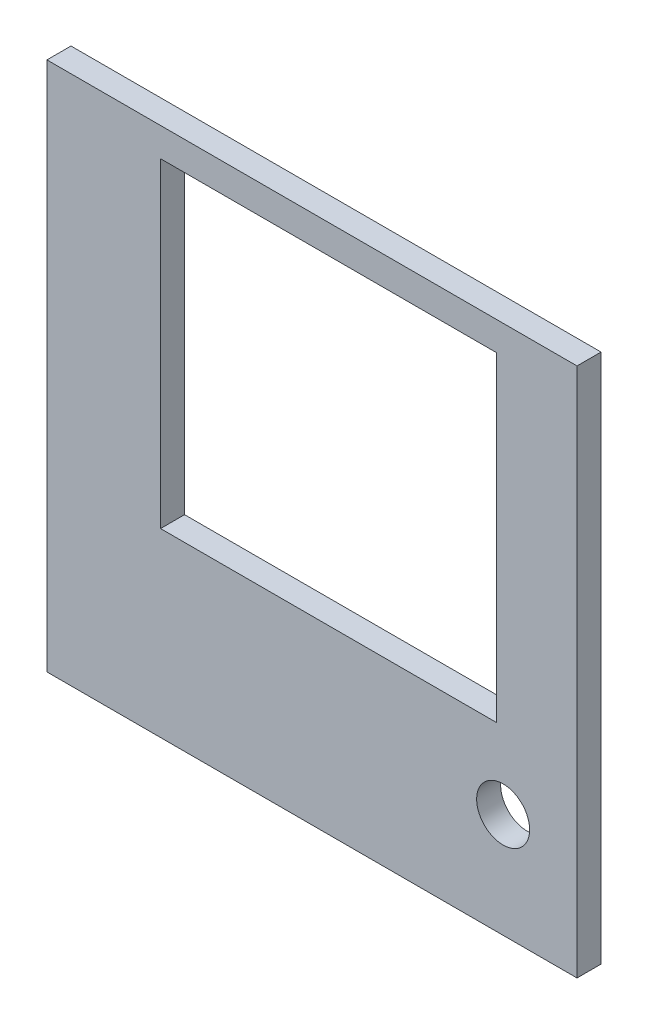
ISO-10303-21;
HEADER;
FILE_DESCRIPTION(('STEP AP214'),'2;1');
FILE_NAME('part.step','',(''),(''),'','','');
FILE_SCHEMA(('AUTOMOTIVE_DESIGN { 1 0 10303 214 1 1 1 1 }'));
ENDSEC;
DATA;
#1=APPLICATION_CONTEXT('core data for automotive mechanical design processes');
#2=APPLICATION_PROTOCOL_DEFINITION('international standard','automotive_design',2000,#1);
#3=PRODUCT_CONTEXT('',#1,'mechanical');
#4=PRODUCT('Part','Part','',(#3));
#5=PRODUCT_RELATED_PRODUCT_CATEGORY('part','',(#4));
#6=PRODUCT_DEFINITION_FORMATION('','',#4);
#7=PRODUCT_DEFINITION_CONTEXT('part definition',#1,'design');
#8=PRODUCT_DEFINITION('design','',#6,#7);
#9=PRODUCT_DEFINITION_SHAPE('','',#8);
#10=(LENGTH_UNIT() NAMED_UNIT(*) SI_UNIT(.MILLI.,.METRE.));
#11=(NAMED_UNIT(*) PLANE_ANGLE_UNIT() SI_UNIT($,.RADIAN.));
#12=(NAMED_UNIT(*) SI_UNIT($,.STERADIAN.) SOLID_ANGLE_UNIT());
#13=UNCERTAINTY_MEASURE_WITH_UNIT(LENGTH_MEASURE(1.E-05),#10,'distance_accuracy_value','');
#14=(GEOMETRIC_REPRESENTATION_CONTEXT(3) GLOBAL_UNCERTAINTY_ASSIGNED_CONTEXT((#13)) GLOBAL_UNIT_ASSIGNED_CONTEXT((#10,
#11,#12)) REPRESENTATION_CONTEXT('',''));
#15=CARTESIAN_POINT('',(0.,0.,0.));
#16=DIRECTION('',(0.,0.,1.));
#17=DIRECTION('',(1.,0.,0.));
#18=AXIS2_PLACEMENT_3D('',#15,#16,#17);
#19=CARTESIAN_POINT('',(0.,0.,3.175));
#20=DIRECTION('',(0.,0.,-1.));
#21=DIRECTION('',(-1.,0.,0.));
#22=AXIS2_PLACEMENT_3D('',#19,#20,#21);
#23=PLANE('',#22);
#24=DIRECTION('',(0.,-1.,0.));
#25=VECTOR('',#24,1.);
#26=CARTESIAN_POINT('',(0.,0.,3.175));
#27=LINE('',#26,#25);
#28=CARTESIAN_POINT('',(0.,70.,3.175));
#29=VERTEX_POINT('',#28);
#30=CARTESIAN_POINT('',(0.,0.,3.175));
#31=VERTEX_POINT('',#30);
#32=EDGE_CURVE('E137',#29,#31,#27,.T.);
#33=ORIENTED_EDGE('',*,*,#32,.T.);
#34=DIRECTION('',(1.,0.,0.));
#35=VECTOR('',#34,1.);
#36=CARTESIAN_POINT('',(0.,0.,3.175));
#37=LINE('',#36,#35);
#38=CARTESIAN_POINT('',(70.,0.,3.175));
#39=VERTEX_POINT('',#38);
#40=EDGE_CURVE('E140',#31,#39,#37,.T.);
#41=ORIENTED_EDGE('',*,*,#40,.T.);
#42=DIRECTION('',(0.,1.,0.));
#43=VECTOR('',#42,1.);
#44=CARTESIAN_POINT('',(70.,0.,3.175));
#45=LINE('',#44,#43);
#46=CARTESIAN_POINT('',(70.,70.,3.175));
#47=VERTEX_POINT('',#46);
#48=EDGE_CURVE('E143',#39,#47,#45,.T.);
#49=ORIENTED_EDGE('',*,*,#48,.T.);
#50=DIRECTION('',(-1.,0.,0.));
#51=VECTOR('',#50,1.);
#52=CARTESIAN_POINT('',(0.,70.,3.175));
#53=LINE('',#52,#51);
#54=EDGE_CURVE('E145',#47,#29,#53,.T.);
#55=ORIENTED_EDGE('',*,*,#54,.T.);
#56=EDGE_LOOP('',(#33,#41,#49,#55));
#57=FACE_BOUND('',#56,.T.);
#58=DIRECTION('',(0.,1.,0.));
#59=VECTOR('',#58,1.);
#60=CARTESIAN_POINT('',(59.35,66.2,3.175));
#61=LINE('',#60,#59);
#62=CARTESIAN_POINT('',(59.35,23.9,3.175));
#63=VERTEX_POINT('',#62);
#64=CARTESIAN_POINT('',(59.35,66.2,3.175));
#65=VERTEX_POINT('',#64);
#66=EDGE_CURVE('E98',#63,#65,#61,.T.);
#67=ORIENTED_EDGE('',*,*,#66,.F.);
#68=DIRECTION('',(1.,0.,0.));
#69=VECTOR('',#68,1.);
#70=CARTESIAN_POINT('',(59.35,23.9,3.175));
#71=LINE('',#70,#69);
#72=CARTESIAN_POINT('',(15.,23.9,3.175));
#73=VERTEX_POINT('',#72);
#74=EDGE_CURVE('E121',#73,#63,#71,.T.);
#75=ORIENTED_EDGE('',*,*,#74,.F.);
#76=DIRECTION('',(0.,-1.,0.));
#77=VECTOR('',#76,1.);
#78=CARTESIAN_POINT('',(15.,66.2,3.175));
#79=LINE('',#78,#77);
#80=CARTESIAN_POINT('',(15.,66.2,3.175));
#81=VERTEX_POINT('',#80);
#82=EDGE_CURVE('E119',#81,#73,#79,.T.);
#83=ORIENTED_EDGE('',*,*,#82,.F.);
#84=DIRECTION('',(-1.,0.,0.));
#85=VECTOR('',#84,1.);
#86=CARTESIAN_POINT('',(59.35,66.2,3.175));
#87=LINE('',#86,#85);
#88=EDGE_CURVE('E106',#65,#81,#87,.T.);
#89=ORIENTED_EDGE('',*,*,#88,.F.);
#90=EDGE_LOOP('',(#67,#75,#83,#89));
#91=FACE_BOUND('',#90,.T.);
#92=CARTESIAN_POINT('',(60.2450000000025,13.8250000000004,3.175));
#93=DIRECTION('',(0.,0.,1.));
#94=DIRECTION('',(1.,0.,0.));
#95=AXIS2_PLACEMENT_3D('',#92,#93,#94);
#96=CIRCLE('',#95,3.50000000000001);
#97=CARTESIAN_POINT('',(63.7450000000025,13.8250000000004,3.175));
#98=VERTEX_POINT('',#97);
#99=EDGE_CURVE('E127',#98,#98,#96,.T.);
#100=ORIENTED_EDGE('',*,*,#99,.F.);
#101=EDGE_LOOP('',(#100));
#102=FACE_BOUND('',#101,.T.);
#103=ADVANCED_FACE('F33',(#57,#91,#102),#23,.F.);
#104=CARTESIAN_POINT('',(0.,0.,0.));
#105=DIRECTION('',(0.,0.,-1.));
#106=DIRECTION('',(-1.,0.,0.));
#107=AXIS2_PLACEMENT_3D('',#104,#105,#106);
#108=PLANE('',#107);
#109=DIRECTION('',(1.,0.,0.));
#110=VECTOR('',#109,1.);
#111=CARTESIAN_POINT('',(59.35,23.9,0.));
#112=LINE('',#111,#110);
#113=CARTESIAN_POINT('',(15.,23.9,0.));
#114=VERTEX_POINT('',#113);
#115=CARTESIAN_POINT('',(59.35,23.9,0.));
#116=VERTEX_POINT('',#115);
#117=EDGE_CURVE('E107',#114,#116,#112,.T.);
#118=ORIENTED_EDGE('',*,*,#117,.T.);
#119=DIRECTION('',(0.,1.,0.));
#120=VECTOR('',#119,1.);
#121=CARTESIAN_POINT('',(59.35,66.2,0.));
#122=LINE('',#121,#120);
#123=CARTESIAN_POINT('',(59.35,66.2,0.));
#124=VERTEX_POINT('',#123);
#125=EDGE_CURVE('E56',#116,#124,#122,.T.);
#126=ORIENTED_EDGE('',*,*,#125,.T.);
#127=DIRECTION('',(-1.,0.,0.));
#128=VECTOR('',#127,1.);
#129=CARTESIAN_POINT('',(59.35,66.2,0.));
#130=LINE('',#129,#128);
#131=CARTESIAN_POINT('',(15.,66.2,0.));
#132=VERTEX_POINT('',#131);
#133=EDGE_CURVE('E113',#124,#132,#130,.T.);
#134=ORIENTED_EDGE('',*,*,#133,.T.);
#135=DIRECTION('',(0.,-1.,0.));
#136=VECTOR('',#135,1.);
#137=CARTESIAN_POINT('',(15.,66.2,0.));
#138=LINE('',#137,#136);
#139=EDGE_CURVE('E129',#132,#114,#138,.T.);
#140=ORIENTED_EDGE('',*,*,#139,.T.);
#141=EDGE_LOOP('',(#118,#126,#134,#140));
#142=FACE_BOUND('',#141,.T.);
#143=DIRECTION('',(0.,-1.,0.));
#144=VECTOR('',#143,1.);
#145=CARTESIAN_POINT('',(0.,0.,0.));
#146=LINE('',#145,#144);
#147=CARTESIAN_POINT('',(0.,70.,0.));
#148=VERTEX_POINT('',#147);
#149=CARTESIAN_POINT('',(0.,0.,0.));
#150=VERTEX_POINT('',#149);
#151=EDGE_CURVE('E114',#148,#150,#146,.T.);
#152=ORIENTED_EDGE('',*,*,#151,.F.);
#153=DIRECTION('',(-1.,0.,0.));
#154=VECTOR('',#153,1.);
#155=CARTESIAN_POINT('',(0.,70.,0.));
#156=LINE('',#155,#154);
#157=CARTESIAN_POINT('',(70.,70.,0.));
#158=VERTEX_POINT('',#157);
#159=EDGE_CURVE('E141',#158,#148,#156,.T.);
#160=ORIENTED_EDGE('',*,*,#159,.F.);
#161=DIRECTION('',(0.,1.,0.));
#162=VECTOR('',#161,1.);
#163=CARTESIAN_POINT('',(70.,0.,0.));
#164=LINE('',#163,#162);
#165=CARTESIAN_POINT('',(70.,0.,0.));
#166=VERTEX_POINT('',#165);
#167=EDGE_CURVE('E152',#166,#158,#164,.T.);
#168=ORIENTED_EDGE('',*,*,#167,.F.);
#169=DIRECTION('',(1.,0.,0.));
#170=VECTOR('',#169,1.);
#171=CARTESIAN_POINT('',(0.,0.,0.));
#172=LINE('',#171,#170);
#173=EDGE_CURVE('E150',#150,#166,#172,.T.);
#174=ORIENTED_EDGE('',*,*,#173,.F.);
#175=EDGE_LOOP('',(#152,#160,#168,#174));
#176=FACE_BOUND('',#175,.T.);
#177=CARTESIAN_POINT('',(60.2450000000025,13.8250000000004,0.));
#178=DIRECTION('',(0.,0.,1.));
#179=DIRECTION('',(1.,0.,0.));
#180=AXIS2_PLACEMENT_3D('',#177,#178,#179);
#181=CIRCLE('',#180,3.50000000000001);
#182=CARTESIAN_POINT('',(63.7450000000025,13.8250000000004,0.));
#183=VERTEX_POINT('',#182);
#184=EDGE_CURVE('E224',#183,#183,#181,.T.);
#185=ORIENTED_EDGE('',*,*,#184,.T.);
#186=EDGE_LOOP('',(#185));
#187=FACE_BOUND('',#186,.T.);
#188=ADVANCED_FACE('F170',(#142,#176,#187),#108,.T.);
#189=CARTESIAN_POINT('',(0.,0.,3.175));
#190=DIRECTION('',(1.,0.,0.));
#191=DIRECTION('',(0.,0.,-1.));
#192=AXIS2_PLACEMENT_3D('',#189,#190,#191);
#193=PLANE('',#192);
#194=ORIENTED_EDGE('',*,*,#151,.T.);
#195=DIRECTION('',(0.,0.,-1.));
#196=VECTOR('',#195,1.);
#197=CARTESIAN_POINT('',(0.,0.,3.175));
#198=LINE('',#197,#196);
#199=EDGE_CURVE('E11',#31,#150,#198,.T.);
#200=ORIENTED_EDGE('',*,*,#199,.F.);
#201=ORIENTED_EDGE('',*,*,#32,.F.);
#202=DIRECTION('',(0.,0.,-1.));
#203=VECTOR('',#202,1.);
#204=CARTESIAN_POINT('',(0.,70.,3.175));
#205=LINE('',#204,#203);
#206=EDGE_CURVE('E147',#29,#148,#205,.T.);
#207=ORIENTED_EDGE('',*,*,#206,.T.);
#208=EDGE_LOOP('',(#194,#200,#201,#207));
#209=FACE_BOUND('',#208,.T.);
#210=ADVANCED_FACE('F35',(#209),#193,.F.);
#211=CARTESIAN_POINT('',(0.,0.,3.175));
#212=DIRECTION('',(0.,1.,0.));
#213=DIRECTION('',(0.,0.,1.));
#214=AXIS2_PLACEMENT_3D('',#211,#212,#213);
#215=PLANE('',#214);
#216=ORIENTED_EDGE('',*,*,#173,.T.);
#217=DIRECTION('',(0.,0.,-1.));
#218=VECTOR('',#217,1.);
#219=CARTESIAN_POINT('',(70.,0.,3.175));
#220=LINE('',#219,#218);
#221=EDGE_CURVE('E41',#39,#166,#220,.T.);
#222=ORIENTED_EDGE('',*,*,#221,.F.);
#223=ORIENTED_EDGE('',*,*,#40,.F.);
#224=ORIENTED_EDGE('',*,*,#199,.T.);
#225=EDGE_LOOP('',(#216,#222,#223,#224));
#226=FACE_BOUND('',#225,.T.);
#227=ADVANCED_FACE('F180',(#226),#215,.F.);
#228=CARTESIAN_POINT('',(70.,0.,3.175));
#229=DIRECTION('',(-1.,0.,0.));
#230=DIRECTION('',(0.,0.,1.));
#231=AXIS2_PLACEMENT_3D('',#228,#229,#230);
#232=PLANE('',#231);
#233=ORIENTED_EDGE('',*,*,#167,.T.);
#234=DIRECTION('',(0.,0.,-1.));
#235=VECTOR('',#234,1.);
#236=CARTESIAN_POINT('',(70.,70.,3.175));
#237=LINE('',#236,#235);
#238=EDGE_CURVE('E157',#47,#158,#237,.T.);
#239=ORIENTED_EDGE('',*,*,#238,.F.);
#240=ORIENTED_EDGE('',*,*,#48,.F.);
#241=ORIENTED_EDGE('',*,*,#221,.T.);
#242=EDGE_LOOP('',(#233,#239,#240,#241));
#243=FACE_BOUND('',#242,.T.);
#244=ADVANCED_FACE('F164',(#243),#232,.F.);
#245=CARTESIAN_POINT('',(0.,70.,3.175));
#246=DIRECTION('',(0.,-1.,0.));
#247=DIRECTION('',(0.,0.,-1.));
#248=AXIS2_PLACEMENT_3D('',#245,#246,#247);
#249=PLANE('',#248);
#250=ORIENTED_EDGE('',*,*,#159,.T.);
#251=ORIENTED_EDGE('',*,*,#206,.F.);
#252=ORIENTED_EDGE('',*,*,#54,.F.);
#253=ORIENTED_EDGE('',*,*,#238,.T.);
#254=EDGE_LOOP('',(#250,#251,#252,#253));
#255=FACE_BOUND('',#254,.T.);
#256=ADVANCED_FACE('F174',(#255),#249,.F.);
#257=CARTESIAN_POINT('',(59.35,66.2,3.175));
#258=DIRECTION('',(-1.,0.,0.));
#259=DIRECTION('',(0.,-1.,0.));
#260=AXIS2_PLACEMENT_3D('',#257,#258,#259);
#261=PLANE('',#260);
#262=ORIENTED_EDGE('',*,*,#125,.F.);
#263=DIRECTION('',(0.,0.,-1.));
#264=VECTOR('',#263,1.);
#265=CARTESIAN_POINT('',(59.35,23.9,3.175));
#266=LINE('',#265,#264);
#267=EDGE_CURVE('E102',#63,#116,#266,.T.);
#268=ORIENTED_EDGE('',*,*,#267,.F.);
#269=ORIENTED_EDGE('',*,*,#66,.T.);
#270=DIRECTION('',(0.,0.,-1.));
#271=VECTOR('',#270,1.);
#272=CARTESIAN_POINT('',(59.35,66.2,3.175));
#273=LINE('',#272,#271);
#274=EDGE_CURVE('E101',#65,#124,#273,.T.);
#275=ORIENTED_EDGE('',*,*,#274,.T.);
#276=EDGE_LOOP('',(#262,#268,#269,#275));
#277=FACE_BOUND('',#276,.T.);
#278=ADVANCED_FACE('F100',(#277),#261,.T.);
#279=CARTESIAN_POINT('',(59.35,66.2,3.175));
#280=DIRECTION('',(0.,-1.,0.));
#281=DIRECTION('',(1.,0.,0.));
#282=AXIS2_PLACEMENT_3D('',#279,#280,#281);
#283=PLANE('',#282);
#284=ORIENTED_EDGE('',*,*,#133,.F.);
#285=ORIENTED_EDGE('',*,*,#274,.F.);
#286=ORIENTED_EDGE('',*,*,#88,.T.);
#287=DIRECTION('',(0.,0.,-1.));
#288=VECTOR('',#287,1.);
#289=CARTESIAN_POINT('',(15.,66.2,3.175));
#290=LINE('',#289,#288);
#291=EDGE_CURVE('E115',#81,#132,#290,.T.);
#292=ORIENTED_EDGE('',*,*,#291,.T.);
#293=EDGE_LOOP('',(#284,#285,#286,#292));
#294=FACE_BOUND('',#293,.T.);
#295=ADVANCED_FACE('F110',(#294),#283,.T.);
#296=CARTESIAN_POINT('',(15.,66.2,3.175));
#297=DIRECTION('',(1.,0.,0.));
#298=DIRECTION('',(0.,1.,0.));
#299=AXIS2_PLACEMENT_3D('',#296,#297,#298);
#300=PLANE('',#299);
#301=ORIENTED_EDGE('',*,*,#139,.F.);
#302=ORIENTED_EDGE('',*,*,#291,.F.);
#303=ORIENTED_EDGE('',*,*,#82,.T.);
#304=DIRECTION('',(0.,0.,-1.));
#305=VECTOR('',#304,1.);
#306=CARTESIAN_POINT('',(15.,23.9,3.175));
#307=LINE('',#306,#305);
#308=EDGE_CURVE('E48',#73,#114,#307,.T.);
#309=ORIENTED_EDGE('',*,*,#308,.T.);
#310=EDGE_LOOP('',(#301,#302,#303,#309));
#311=FACE_BOUND('',#310,.T.);
#312=ADVANCED_FACE('F204',(#311),#300,.T.);
#313=CARTESIAN_POINT('',(59.35,23.9,3.175));
#314=DIRECTION('',(0.,1.,0.));
#315=DIRECTION('',(-1.,0.,0.));
#316=AXIS2_PLACEMENT_3D('',#313,#314,#315);
#317=PLANE('',#316);
#318=ORIENTED_EDGE('',*,*,#117,.F.);
#319=ORIENTED_EDGE('',*,*,#308,.F.);
#320=ORIENTED_EDGE('',*,*,#74,.T.);
#321=ORIENTED_EDGE('',*,*,#267,.T.);
#322=EDGE_LOOP('',(#318,#319,#320,#321));
#323=FACE_BOUND('',#322,.T.);
#324=ADVANCED_FACE('F208',(#323),#317,.T.);
#325=CARTESIAN_POINT('',(60.2450000000025,13.8250000000004,3.175));
#326=DIRECTION('',(0.,0.,-1.));
#327=DIRECTION('',(-1.,0.,0.));
#328=AXIS2_PLACEMENT_3D('',#325,#326,#327);
#329=CYLINDRICAL_SURFACE('',#328,3.50000000000001);
#330=ORIENTED_EDGE('',*,*,#99,.T.);
#331=EDGE_LOOP('',(#330));
#332=FACE_BOUND('',#331,.T.);
#333=ORIENTED_EDGE('',*,*,#184,.F.);
#334=EDGE_LOOP('',(#333));
#335=FACE_BOUND('',#334,.T.);
#336=ADVANCED_FACE('F214',(#332,#335),#329,.F.);
#337=CLOSED_SHELL('',(#103,#188,#210,#227,#244,#256,#278,#295,#312,#324,#336));
#338=MANIFOLD_SOLID_BREP('B2',#337);
#339=ADVANCED_BREP_SHAPE_REPRESENTATION('',(#18,#338),#14);
#340=SHAPE_DEFINITION_REPRESENTATION(#9,#339);
ENDSEC;
END-ISO-10303-21;
